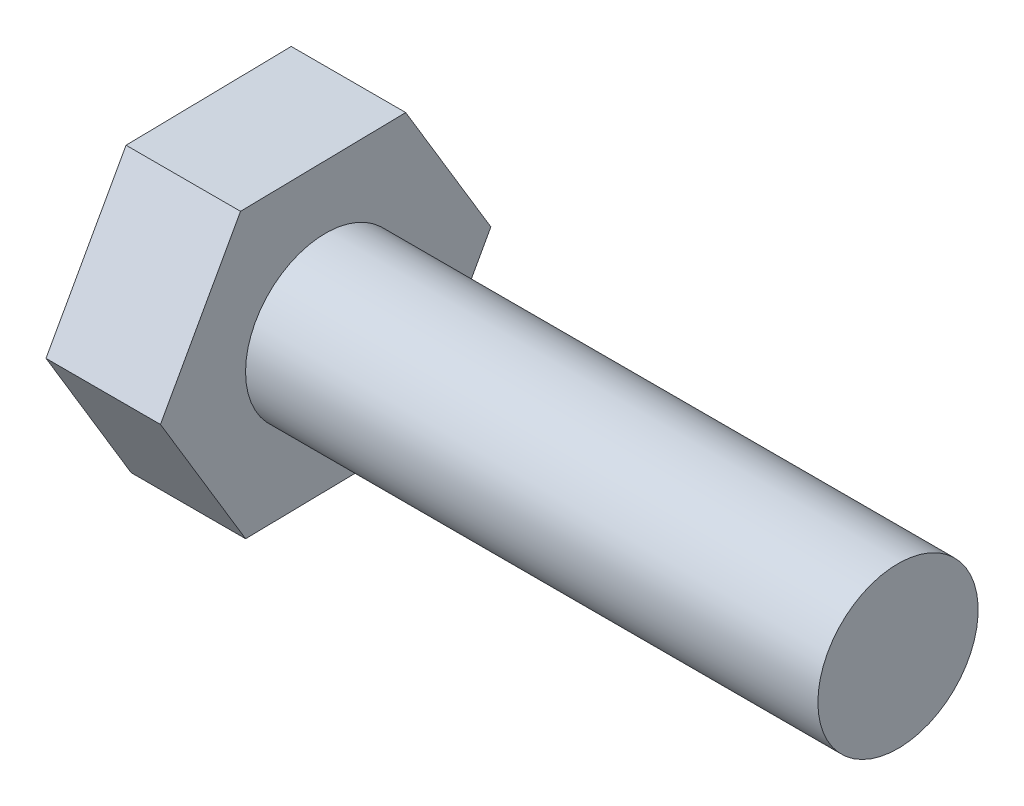
ISO-10303-21;
HEADER;
FILE_DESCRIPTION(('STEP AP214'),'2;1');
FILE_NAME('part.step','',(''),(''),'','','');
FILE_SCHEMA(('AUTOMOTIVE_DESIGN { 1 0 10303 214 1 1 1 1 }'));
ENDSEC;
DATA;
#1=APPLICATION_CONTEXT('core data for automotive mechanical design processes');
#2=APPLICATION_PROTOCOL_DEFINITION('international standard','automotive_design',2000,#1);
#3=PRODUCT_CONTEXT('',#1,'mechanical');
#4=PRODUCT('Part','Part','',(#3));
#5=PRODUCT_RELATED_PRODUCT_CATEGORY('part','',(#4));
#6=PRODUCT_DEFINITION_FORMATION('','',#4);
#7=PRODUCT_DEFINITION_CONTEXT('part definition',#1,'design');
#8=PRODUCT_DEFINITION('design','',#6,#7);
#9=PRODUCT_DEFINITION_SHAPE('','',#8);
#10=(LENGTH_UNIT() NAMED_UNIT(*) SI_UNIT(.MILLI.,.METRE.));
#11=(NAMED_UNIT(*) PLANE_ANGLE_UNIT() SI_UNIT($,.RADIAN.));
#12=(NAMED_UNIT(*) SI_UNIT($,.STERADIAN.) SOLID_ANGLE_UNIT());
#13=UNCERTAINTY_MEASURE_WITH_UNIT(LENGTH_MEASURE(1.E-05),#10,'distance_accuracy_value','');
#14=(GEOMETRIC_REPRESENTATION_CONTEXT(3) GLOBAL_UNCERTAINTY_ASSIGNED_CONTEXT((#13)) GLOBAL_UNIT_ASSIGNED_CONTEXT((#10,
#11,#12)) REPRESENTATION_CONTEXT('',''));
#15=CARTESIAN_POINT('',(0.,0.,0.));
#16=DIRECTION('',(0.,0.,1.));
#17=DIRECTION('',(1.,0.,0.));
#18=AXIS2_PLACEMENT_3D('',#15,#16,#17);
#19=CARTESIAN_POINT('',(-10.6,0.256906077015476,-14.4314702161951));
#20=DIRECTION('',(0.,-0.515335157468267,0.856988725408425));
#21=DIRECTION('',(0.,0.856988725408425,0.515335157468267));
#22=AXIS2_PLACEMENT_3D('',#19,#20,#21);
#23=PLANE('',#22);
#24=DIRECTION('',(0.,0.856988725408425,0.515335157468267));
#25=VECTOR('',#24,1.);
#26=CARTESIAN_POINT('',(-0.6,0.256906077015476,-14.4314702161951));
#27=LINE('',#26,#25);
#28=CARTESIAN_POINT('',(-0.6,0.256906077015476,-14.4314702161951));
#29=VERTEX_POINT('',#28);
#30=CARTESIAN_POINT('',(-0.6,12.6264728596912,-6.99324791901554));
#31=VERTEX_POINT('',#30);
#32=EDGE_CURVE('E122',#29,#31,#27,.T.);
#33=ORIENTED_EDGE('',*,*,#32,.F.);
#34=DIRECTION('',(1.,0.,0.));
#35=VECTOR('',#34,1.);
#36=CARTESIAN_POINT('',(-10.6,0.256906077015476,-14.4314702161951));
#37=LINE('',#36,#35);
#38=CARTESIAN_POINT('',(-10.6,0.256906077015476,-14.4314702161951));
#39=VERTEX_POINT('',#38);
#40=EDGE_CURVE('E121',#39,#29,#37,.T.);
#41=ORIENTED_EDGE('',*,*,#40,.F.);
#42=DIRECTION('',(0.,0.856988725408425,0.515335157468267));
#43=VECTOR('',#42,1.);
#44=CARTESIAN_POINT('',(-10.6,0.256906077015476,-14.4314702161951));
#45=LINE('',#44,#43);
#46=CARTESIAN_POINT('',(-10.6,12.6264728596912,-6.99324791901554));
#47=VERTEX_POINT('',#46);
#48=EDGE_CURVE('E134',#39,#47,#45,.T.);
#49=ORIENTED_EDGE('',*,*,#48,.T.);
#50=DIRECTION('',(1.,0.,0.));
#51=VECTOR('',#50,1.);
#52=CARTESIAN_POINT('',(-10.6,12.6264728596912,-6.99324791901554));
#53=LINE('',#52,#51);
#54=EDGE_CURVE('E141',#47,#31,#53,.T.);
#55=ORIENTED_EDGE('',*,*,#54,.T.);
#56=EDGE_LOOP('',(#33,#41,#49,#55));
#57=FACE_BOUND('',#56,.T.);
#58=ADVANCED_FACE('F38',(#57),#23,.F.);
#59=CARTESIAN_POINT('',(-10.6,12.6264728596912,-6.99324791901554));
#60=DIRECTION('',(0.,-0.999841585694676,-0.01779897512656));
#61=DIRECTION('',(0.,-0.01779897512656,0.999841585694676));
#62=AXIS2_PLACEMENT_3D('',#59,#60,#61);
#63=PLANE('',#62);
#64=DIRECTION('',(0.,-0.01779897512656,0.999841585694676));
#65=VECTOR('',#64,1.);
#66=CARTESIAN_POINT('',(-0.6,12.6264728596912,-6.99324791901554));
#67=LINE('',#66,#65);
#68=CARTESIAN_POINT('',(-0.6,12.3695667826757,7.43822229717955));
#69=VERTEX_POINT('',#68);
#70=EDGE_CURVE('E124',#31,#69,#67,.T.);
#71=ORIENTED_EDGE('',*,*,#70,.F.);
#72=ORIENTED_EDGE('',*,*,#54,.F.);
#73=DIRECTION('',(0.,-0.01779897512656,0.999841585694676));
#74=VECTOR('',#73,1.);
#75=CARTESIAN_POINT('',(-10.6,12.6264728596912,-6.99324791901554));
#76=LINE('',#75,#74);
#77=CARTESIAN_POINT('',(-10.6,12.3695667826757,7.43822229717955));
#78=VERTEX_POINT('',#77);
#79=EDGE_CURVE('E87',#47,#78,#76,.T.);
#80=ORIENTED_EDGE('',*,*,#79,.T.);
#81=DIRECTION('',(1.,0.,0.));
#82=VECTOR('',#81,1.);
#83=CARTESIAN_POINT('',(-10.6,12.3695667826757,7.43822229717955));
#84=LINE('',#83,#82);
#85=EDGE_CURVE('E138',#78,#69,#84,.T.);
#86=ORIENTED_EDGE('',*,*,#85,.T.);
#87=EDGE_LOOP('',(#71,#72,#80,#86));
#88=FACE_BOUND('',#87,.T.);
#89=ADVANCED_FACE('F163',(#88),#63,.F.);
#90=CARTESIAN_POINT('',(-10.6,12.3695667826757,7.43822229717955));
#91=DIRECTION('',(0.,-0.484506428226409,-0.874787700534986));
#92=DIRECTION('',(0.,-0.874787700534986,0.484506428226409));
#93=AXIS2_PLACEMENT_3D('',#90,#91,#92);
#94=PLANE('',#93);
#95=DIRECTION('',(0.,-0.874787700534985,0.484506428226409));
#96=VECTOR('',#95,1.);
#97=CARTESIAN_POINT('',(-0.6,12.3695667826757,7.43822229717955));
#98=LINE('',#97,#96);
#99=CARTESIAN_POINT('',(-0.6,-0.256906077015476,14.4314702161951));
#100=VERTEX_POINT('',#99);
#101=EDGE_CURVE('E127',#69,#100,#98,.T.);
#102=ORIENTED_EDGE('',*,*,#101,.F.);
#103=ORIENTED_EDGE('',*,*,#85,.F.);
#104=DIRECTION('',(0.,-0.874787700534985,0.484506428226409));
#105=VECTOR('',#104,1.);
#106=CARTESIAN_POINT('',(-10.6,12.3695667826757,7.43822229717955));
#107=LINE('',#106,#105);
#108=CARTESIAN_POINT('',(-10.6,-0.256906077015476,14.4314702161951));
#109=VERTEX_POINT('',#108);
#110=EDGE_CURVE('E115',#78,#109,#107,.T.);
#111=ORIENTED_EDGE('',*,*,#110,.T.);
#112=DIRECTION('',(1.,0.,0.));
#113=VECTOR('',#112,1.);
#114=CARTESIAN_POINT('',(-10.6,-0.256906077015476,14.4314702161951));
#115=LINE('',#114,#113);
#116=EDGE_CURVE('E109',#109,#100,#115,.T.);
#117=ORIENTED_EDGE('',*,*,#116,.T.);
#118=EDGE_LOOP('',(#102,#103,#111,#117));
#119=FACE_BOUND('',#118,.T.);
#120=ADVANCED_FACE('F168',(#119),#94,.F.);
#121=CARTESIAN_POINT('',(-10.6,-0.256906077015476,14.4314702161951));
#122=DIRECTION('',(0.,0.515335157468266,-0.856988725408425));
#123=DIRECTION('',(0.,-0.856988725408425,-0.515335157468266));
#124=AXIS2_PLACEMENT_3D('',#121,#122,#123);
#125=PLANE('',#124);
#126=DIRECTION('',(0.,-0.856988725408425,-0.515335157468266));
#127=VECTOR('',#126,1.);
#128=CARTESIAN_POINT('',(-0.6,-0.256906077015476,14.4314702161951));
#129=LINE('',#128,#127);
#130=CARTESIAN_POINT('',(-0.6,-12.6264728596912,6.99324791901554));
#131=VERTEX_POINT('',#130);
#132=EDGE_CURVE('E130',#100,#131,#129,.T.);
#133=ORIENTED_EDGE('',*,*,#132,.F.);
#134=ORIENTED_EDGE('',*,*,#116,.F.);
#135=DIRECTION('',(0.,-0.856988725408425,-0.515335157468266));
#136=VECTOR('',#135,1.);
#137=CARTESIAN_POINT('',(-10.6,-0.256906077015476,14.4314702161951));
#138=LINE('',#137,#136);
#139=CARTESIAN_POINT('',(-10.6,-12.6264728596912,6.99324791901554));
#140=VERTEX_POINT('',#139);
#141=EDGE_CURVE('E99',#109,#140,#138,.T.);
#142=ORIENTED_EDGE('',*,*,#141,.T.);
#143=DIRECTION('',(1.,0.,0.));
#144=VECTOR('',#143,1.);
#145=CARTESIAN_POINT('',(-10.6,-12.6264728596912,6.99324791901554));
#146=LINE('',#145,#144);
#147=EDGE_CURVE('E104',#140,#131,#146,.T.);
#148=ORIENTED_EDGE('',*,*,#147,.T.);
#149=EDGE_LOOP('',(#133,#134,#142,#148));
#150=FACE_BOUND('',#149,.T.);
#151=ADVANCED_FACE('F112',(#150),#125,.F.);
#152=CARTESIAN_POINT('',(-10.6,-12.6264728596912,6.99324791901554));
#153=DIRECTION('',(0.,0.999841585694676,0.0177989751265602));
#154=DIRECTION('',(0.,0.0177989751265602,-0.999841585694676));
#155=AXIS2_PLACEMENT_3D('',#152,#153,#154);
#156=PLANE('',#155);
#157=DIRECTION('',(0.,0.0177989751265602,-0.999841585694676));
#158=VECTOR('',#157,1.);
#159=CARTESIAN_POINT('',(-0.6,-12.6264728596912,6.99324791901554));
#160=LINE('',#159,#158);
#161=CARTESIAN_POINT('',(-0.6,-12.3695667826757,-7.43822229717955));
#162=VERTEX_POINT('',#161);
#163=EDGE_CURVE('E106',#131,#162,#160,.T.);
#164=ORIENTED_EDGE('',*,*,#163,.F.);
#165=ORIENTED_EDGE('',*,*,#147,.F.);
#166=DIRECTION('',(0.,0.0177989751265602,-0.999841585694676));
#167=VECTOR('',#166,1.);
#168=CARTESIAN_POINT('',(-10.6,-12.6264728596912,6.99324791901554));
#169=LINE('',#168,#167);
#170=CARTESIAN_POINT('',(-10.6,-12.3695667826757,-7.43822229717955));
#171=VERTEX_POINT('',#170);
#172=EDGE_CURVE('E95',#140,#171,#169,.T.);
#173=ORIENTED_EDGE('',*,*,#172,.T.);
#174=DIRECTION('',(1.,0.,0.));
#175=VECTOR('',#174,1.);
#176=CARTESIAN_POINT('',(-10.6,-12.3695667826757,-7.43822229717955));
#177=LINE('',#176,#175);
#178=EDGE_CURVE('E110',#171,#162,#177,.T.);
#179=ORIENTED_EDGE('',*,*,#178,.T.);
#180=EDGE_LOOP('',(#164,#165,#173,#179));
#181=FACE_BOUND('',#180,.T.);
#182=ADVANCED_FACE('F105',(#181),#156,.F.);
#183=CARTESIAN_POINT('',(-10.6,-12.3695667826757,-7.43822229717955));
#184=DIRECTION('',(0.,0.48450642822641,0.874787700534985));
#185=DIRECTION('',(0.,0.874787700534985,-0.48450642822641));
#186=AXIS2_PLACEMENT_3D('',#183,#184,#185);
#187=PLANE('',#186);
#188=DIRECTION('',(0.,0.874787700534985,-0.484506428226409));
#189=VECTOR('',#188,1.);
#190=CARTESIAN_POINT('',(-0.6,-12.3695667826757,-7.43822229717955));
#191=LINE('',#190,#189);
#192=EDGE_CURVE('E75',#162,#29,#191,.T.);
#193=ORIENTED_EDGE('',*,*,#192,.F.);
#194=ORIENTED_EDGE('',*,*,#178,.F.);
#195=DIRECTION('',(0.,0.874787700534985,-0.484506428226409));
#196=VECTOR('',#195,1.);
#197=CARTESIAN_POINT('',(-10.6,-12.3695667826757,-7.43822229717955));
#198=LINE('',#197,#196);
#199=EDGE_CURVE('E55',#171,#39,#198,.T.);
#200=ORIENTED_EDGE('',*,*,#199,.T.);
#201=ORIENTED_EDGE('',*,*,#40,.T.);
#202=EDGE_LOOP('',(#193,#194,#200,#201));
#203=FACE_BOUND('',#202,.T.);
#204=ADVANCED_FACE('F160',(#203),#187,.F.);
#205=CARTESIAN_POINT('',(-10.6,0.,0.));
#206=DIRECTION('',(-1.,0.,0.));
#207=DIRECTION('',(0.,0.,-1.));
#208=AXIS2_PLACEMENT_3D('',#205,#206,#207);
#209=PLANE('',#208);
#210=ORIENTED_EDGE('',*,*,#48,.F.);
#211=ORIENTED_EDGE('',*,*,#199,.F.);
#212=ORIENTED_EDGE('',*,*,#172,.F.);
#213=ORIENTED_EDGE('',*,*,#141,.F.);
#214=ORIENTED_EDGE('',*,*,#110,.F.);
#215=ORIENTED_EDGE('',*,*,#79,.F.);
#216=EDGE_LOOP('',(#210,#211,#212,#213,#214,#215));
#217=FACE_BOUND('',#216,.T.);
#218=ADVANCED_FACE('F97',(#217),#209,.T.);
#219=CARTESIAN_POINT('',(49.4,0.,0.));
#220=DIRECTION('',(-1.,0.,0.));
#221=DIRECTION('',(0.,0.,-1.));
#222=AXIS2_PLACEMENT_3D('',#219,#220,#221);
#223=CYLINDRICAL_SURFACE('',#222,7.);
#224=CARTESIAN_POINT('',(49.4,0.,0.));
#225=DIRECTION('',(-1.,0.,0.));
#226=DIRECTION('',(0.,0.,1.));
#227=AXIS2_PLACEMENT_3D('',#224,#225,#226);
#228=CIRCLE('',#227,7.);
#229=CARTESIAN_POINT('',(49.4,0.,7.));
#230=VERTEX_POINT('',#229);
#231=EDGE_CURVE('E11',#230,#230,#228,.T.);
#232=ORIENTED_EDGE('',*,*,#231,.T.);
#233=EDGE_LOOP('',(#232));
#234=FACE_BOUND('',#233,.T.);
#235=CARTESIAN_POINT('',(-0.6,0.,0.));
#236=DIRECTION('',(-1.,0.,0.));
#237=DIRECTION('',(0.,0.,1.));
#238=AXIS2_PLACEMENT_3D('',#235,#236,#237);
#239=CIRCLE('',#238,7.);
#240=CARTESIAN_POINT('',(-0.6,0.,7.));
#241=VERTEX_POINT('',#240);
#242=EDGE_CURVE('E42',#241,#241,#239,.T.);
#243=ORIENTED_EDGE('',*,*,#242,.F.);
#244=EDGE_LOOP('',(#243));
#245=FACE_BOUND('',#244,.T.);
#246=ADVANCED_FACE('F150',(#234,#245),#223,.T.);
#247=CARTESIAN_POINT('',(49.4,0.,0.));
#248=DIRECTION('',(1.,0.,0.));
#249=DIRECTION('',(0.,0.,1.));
#250=AXIS2_PLACEMENT_3D('',#247,#248,#249);
#251=PLANE('',#250);
#252=ORIENTED_EDGE('',*,*,#231,.F.);
#253=EDGE_LOOP('',(#252));
#254=FACE_BOUND('',#253,.T.);
#255=ADVANCED_FACE('F152',(#254),#251,.T.);
#256=CARTESIAN_POINT('',(-0.6,7.50555349946513,0.));
#257=DIRECTION('',(-1.,0.,0.));
#258=DIRECTION('',(0.,0.,-1.));
#259=AXIS2_PLACEMENT_3D('',#256,#257,#258);
#260=PLANE('',#259);
#261=ORIENTED_EDGE('',*,*,#242,.T.);
#262=EDGE_LOOP('',(#261));
#263=FACE_BOUND('',#262,.T.);
#264=ORIENTED_EDGE('',*,*,#32,.T.);
#265=ORIENTED_EDGE('',*,*,#70,.T.);
#266=ORIENTED_EDGE('',*,*,#101,.T.);
#267=ORIENTED_EDGE('',*,*,#132,.T.);
#268=ORIENTED_EDGE('',*,*,#163,.T.);
#269=ORIENTED_EDGE('',*,*,#192,.T.);
#270=EDGE_LOOP('',(#264,#265,#266,#267,#268,#269));
#271=FACE_BOUND('',#270,.T.);
#272=ADVANCED_FACE('F40',(#263,#271),#260,.F.);
#273=CLOSED_SHELL('',(#58,#89,#120,#151,#182,#204,#218,#246,#255,#272));
#274=MANIFOLD_SOLID_BREP('B2',#273);
#275=ADVANCED_BREP_SHAPE_REPRESENTATION('',(#18,#274),#14);
#276=SHAPE_DEFINITION_REPRESENTATION(#9,#275);
ENDSEC;
END-ISO-10303-21;
